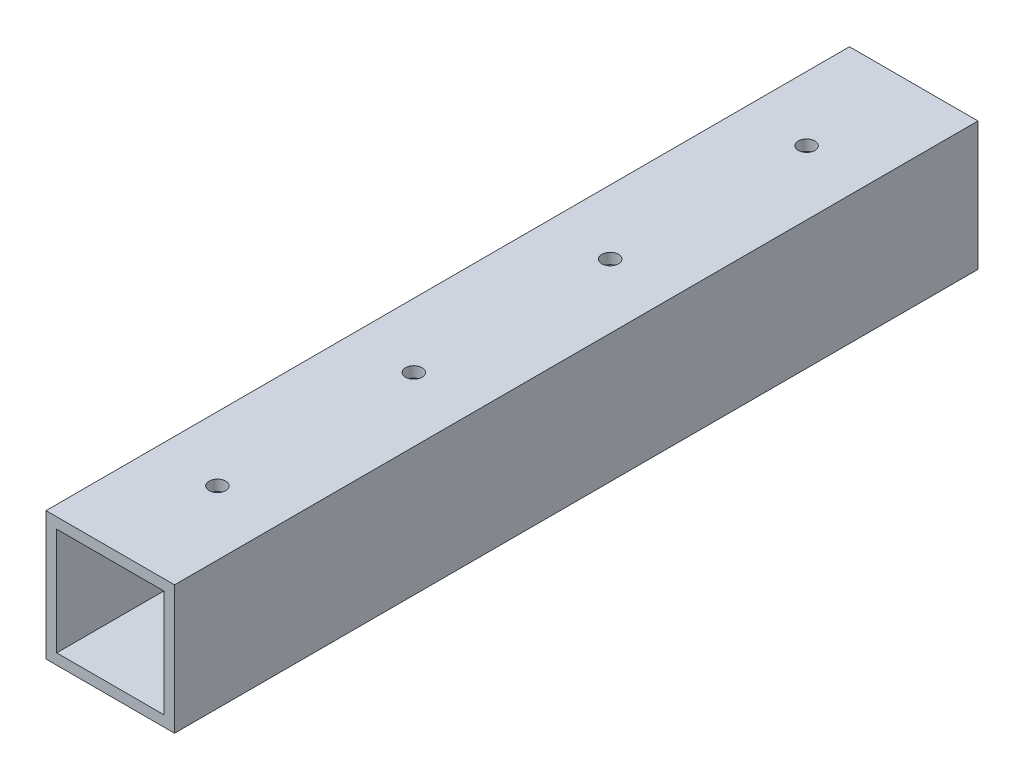
ISO-10303-21;
HEADER;
FILE_DESCRIPTION(('STEP AP214'),'2;1');
FILE_NAME('part.step','',(''),(''),'','','');
FILE_SCHEMA(('AUTOMOTIVE_DESIGN { 1 0 10303 214 1 1 1 1 }'));
ENDSEC;
DATA;
#1=APPLICATION_CONTEXT('core data for automotive mechanical design processes');
#2=APPLICATION_PROTOCOL_DEFINITION('international standard','automotive_design',2000,#1);
#3=PRODUCT_CONTEXT('',#1,'mechanical');
#4=PRODUCT('Part','Part','',(#3));
#5=PRODUCT_RELATED_PRODUCT_CATEGORY('part','',(#4));
#6=PRODUCT_DEFINITION_FORMATION('','',#4);
#7=PRODUCT_DEFINITION_CONTEXT('part definition',#1,'design');
#8=PRODUCT_DEFINITION('design','',#6,#7);
#9=PRODUCT_DEFINITION_SHAPE('','',#8);
#10=(LENGTH_UNIT() NAMED_UNIT(*) SI_UNIT(.MILLI.,.METRE.));
#11=(NAMED_UNIT(*) PLANE_ANGLE_UNIT() SI_UNIT($,.RADIAN.));
#12=(NAMED_UNIT(*) SI_UNIT($,.STERADIAN.) SOLID_ANGLE_UNIT());
#13=UNCERTAINTY_MEASURE_WITH_UNIT(LENGTH_MEASURE(1.E-05),#10,'distance_accuracy_value','');
#14=(GEOMETRIC_REPRESENTATION_CONTEXT(3) GLOBAL_UNCERTAINTY_ASSIGNED_CONTEXT((#13)) GLOBAL_UNIT_ASSIGNED_CONTEXT((#10,
#11,#12)) REPRESENTATION_CONTEXT('',''));
#15=CARTESIAN_POINT('',(0.,0.,0.));
#16=DIRECTION('',(0.,0.,1.));
#17=DIRECTION('',(1.,0.,0.));
#18=AXIS2_PLACEMENT_3D('',#15,#16,#17);
#19=CARTESIAN_POINT('',(0.,0.,238.125));
#20=DIRECTION('',(0.,0.,-1.));
#21=DIRECTION('',(-1.,0.,0.));
#22=AXIS2_PLACEMENT_3D('',#19,#20,#21);
#23=PLANE('',#22);
#24=DIRECTION('',(0.,1.,0.));
#25=VECTOR('',#24,1.);
#26=CARTESIAN_POINT('',(19.05,-19.05,238.125));
#27=LINE('',#26,#25);
#28=CARTESIAN_POINT('',(19.05,-19.05,238.125));
#29=VERTEX_POINT('',#28);
#30=CARTESIAN_POINT('',(19.05,19.05,238.125));
#31=VERTEX_POINT('',#30);
#32=EDGE_CURVE('E154',#29,#31,#27,.T.);
#33=ORIENTED_EDGE('',*,*,#32,.T.);
#34=DIRECTION('',(-1.,0.,0.));
#35=VECTOR('',#34,1.);
#36=CARTESIAN_POINT('',(-19.05,19.05,238.125));
#37=LINE('',#36,#35);
#38=CARTESIAN_POINT('',(-19.05,19.05,238.125));
#39=VERTEX_POINT('',#38);
#40=EDGE_CURVE('E158',#31,#39,#37,.T.);
#41=ORIENTED_EDGE('',*,*,#40,.T.);
#42=DIRECTION('',(0.,-1.,0.));
#43=VECTOR('',#42,1.);
#44=CARTESIAN_POINT('',(-19.05,-19.05,238.125));
#45=LINE('',#44,#43);
#46=CARTESIAN_POINT('',(-19.05,-19.05,238.125));
#47=VERTEX_POINT('',#46);
#48=EDGE_CURVE('E162',#39,#47,#45,.T.);
#49=ORIENTED_EDGE('',*,*,#48,.T.);
#50=DIRECTION('',(1.,0.,0.));
#51=VECTOR('',#50,1.);
#52=CARTESIAN_POINT('',(-19.05,-19.05,238.125));
#53=LINE('',#52,#51);
#54=EDGE_CURVE('E165',#47,#29,#53,.T.);
#55=ORIENTED_EDGE('',*,*,#54,.T.);
#56=EDGE_LOOP('',(#33,#41,#49,#55));
#57=FACE_BOUND('',#56,.T.);
#58=DIRECTION('',(0.,1.,0.));
#59=VECTOR('',#58,1.);
#60=CARTESIAN_POINT('',(15.875,-15.875,238.125));
#61=LINE('',#60,#59);
#62=CARTESIAN_POINT('',(15.875,-15.875,238.125));
#63=VERTEX_POINT('',#62);
#64=CARTESIAN_POINT('',(15.875,15.875,238.125));
#65=VERTEX_POINT('',#64);
#66=EDGE_CURVE('E103',#63,#65,#61,.T.);
#67=ORIENTED_EDGE('',*,*,#66,.F.);
#68=DIRECTION('',(1.,0.,0.));
#69=VECTOR('',#68,1.);
#70=CARTESIAN_POINT('',(-15.875,-15.875,238.125));
#71=LINE('',#70,#69);
#72=CARTESIAN_POINT('',(-15.875,-15.875,238.125));
#73=VERTEX_POINT('',#72);
#74=EDGE_CURVE('E130',#73,#63,#71,.T.);
#75=ORIENTED_EDGE('',*,*,#74,.F.);
#76=DIRECTION('',(0.,-1.,0.));
#77=VECTOR('',#76,1.);
#78=CARTESIAN_POINT('',(-15.875,-15.875,238.125));
#79=LINE('',#78,#77);
#80=CARTESIAN_POINT('',(-15.875,15.875,238.125));
#81=VERTEX_POINT('',#80);
#82=EDGE_CURVE('E125',#81,#73,#79,.T.);
#83=ORIENTED_EDGE('',*,*,#82,.F.);
#84=DIRECTION('',(-1.,0.,0.));
#85=VECTOR('',#84,1.);
#86=CARTESIAN_POINT('',(-15.875,15.875,238.125));
#87=LINE('',#86,#85);
#88=EDGE_CURVE('E112',#65,#81,#87,.T.);
#89=ORIENTED_EDGE('',*,*,#88,.F.);
#90=EDGE_LOOP('',(#67,#75,#83,#89));
#91=FACE_BOUND('',#90,.T.);
#92=ADVANCED_FACE('F35',(#57,#91),#23,.F.);
#93=CARTESIAN_POINT('',(0.,0.,0.));
#94=DIRECTION('',(0.,0.,-1.));
#95=DIRECTION('',(-1.,0.,0.));
#96=AXIS2_PLACEMENT_3D('',#93,#94,#95);
#97=PLANE('',#96);
#98=DIRECTION('',(0.,1.,0.));
#99=VECTOR('',#98,1.);
#100=CARTESIAN_POINT('',(19.05,-19.05,0.));
#101=LINE('',#100,#99);
#102=CARTESIAN_POINT('',(19.05,-19.05,0.));
#103=VERTEX_POINT('',#102);
#104=CARTESIAN_POINT('',(19.05,19.05,0.));
#105=VERTEX_POINT('',#104);
#106=EDGE_CURVE('E121',#103,#105,#101,.T.);
#107=ORIENTED_EDGE('',*,*,#106,.F.);
#108=DIRECTION('',(1.,0.,0.));
#109=VECTOR('',#108,1.);
#110=CARTESIAN_POINT('',(-19.05,-19.05,0.));
#111=LINE('',#110,#109);
#112=CARTESIAN_POINT('',(-19.05,-19.05,0.));
#113=VERTEX_POINT('',#112);
#114=EDGE_CURVE('E159',#113,#103,#111,.T.);
#115=ORIENTED_EDGE('',*,*,#114,.F.);
#116=DIRECTION('',(0.,-1.,0.));
#117=VECTOR('',#116,1.);
#118=CARTESIAN_POINT('',(-19.05,-19.05,0.));
#119=LINE('',#118,#117);
#120=CARTESIAN_POINT('',(-19.05,19.05,0.));
#121=VERTEX_POINT('',#120);
#122=EDGE_CURVE('E175',#121,#113,#119,.T.);
#123=ORIENTED_EDGE('',*,*,#122,.F.);
#124=DIRECTION('',(-1.,0.,0.));
#125=VECTOR('',#124,1.);
#126=CARTESIAN_POINT('',(-19.05,19.05,0.));
#127=LINE('',#126,#125);
#128=EDGE_CURVE('E172',#105,#121,#127,.T.);
#129=ORIENTED_EDGE('',*,*,#128,.F.);
#130=EDGE_LOOP('',(#107,#115,#123,#129));
#131=FACE_BOUND('',#130,.T.);
#132=DIRECTION('',(1.,0.,0.));
#133=VECTOR('',#132,1.);
#134=CARTESIAN_POINT('',(-15.875,-15.875,0.));
#135=LINE('',#134,#133);
#136=CARTESIAN_POINT('',(-15.875,-15.875,0.));
#137=VERTEX_POINT('',#136);
#138=CARTESIAN_POINT('',(15.875,-15.875,0.));
#139=VERTEX_POINT('',#138);
#140=EDGE_CURVE('E113',#137,#139,#135,.T.);
#141=ORIENTED_EDGE('',*,*,#140,.T.);
#142=DIRECTION('',(0.,1.,0.));
#143=VECTOR('',#142,1.);
#144=CARTESIAN_POINT('',(15.875,-15.875,0.));
#145=LINE('',#144,#143);
#146=CARTESIAN_POINT('',(15.875,15.875,0.));
#147=VERTEX_POINT('',#146);
#148=EDGE_CURVE('E61',#139,#147,#145,.T.);
#149=ORIENTED_EDGE('',*,*,#148,.T.);
#150=DIRECTION('',(-1.,0.,0.));
#151=VECTOR('',#150,1.);
#152=CARTESIAN_POINT('',(-15.875,15.875,0.));
#153=LINE('',#152,#151);
#154=CARTESIAN_POINT('',(-15.875,15.875,0.));
#155=VERTEX_POINT('',#154);
#156=EDGE_CURVE('E119',#147,#155,#153,.T.);
#157=ORIENTED_EDGE('',*,*,#156,.T.);
#158=DIRECTION('',(0.,-1.,0.));
#159=VECTOR('',#158,1.);
#160=CARTESIAN_POINT('',(-15.875,-15.875,0.));
#161=LINE('',#160,#159);
#162=EDGE_CURVE('E141',#155,#137,#161,.T.);
#163=ORIENTED_EDGE('',*,*,#162,.T.);
#164=EDGE_LOOP('',(#141,#149,#157,#163));
#165=FACE_BOUND('',#164,.T.);
#166=ADVANCED_FACE('F256',(#131,#165),#97,.T.);
#167=CARTESIAN_POINT('',(19.05,-19.05,238.125));
#168=DIRECTION('',(-1.,0.,0.));
#169=DIRECTION('',(0.,0.,1.));
#170=AXIS2_PLACEMENT_3D('',#167,#168,#169);
#171=PLANE('',#170);
#172=ORIENTED_EDGE('',*,*,#106,.T.);
#173=DIRECTION('',(0.,0.,-1.));
#174=VECTOR('',#173,1.);
#175=CARTESIAN_POINT('',(19.05,19.05,238.125));
#176=LINE('',#175,#174);
#177=EDGE_CURVE('E11',#31,#105,#176,.T.);
#178=ORIENTED_EDGE('',*,*,#177,.F.);
#179=ORIENTED_EDGE('',*,*,#32,.F.);
#180=DIRECTION('',(0.,0.,-1.));
#181=VECTOR('',#180,1.);
#182=CARTESIAN_POINT('',(19.05,-19.05,238.125));
#183=LINE('',#182,#181);
#184=EDGE_CURVE('E168',#29,#103,#183,.T.);
#185=ORIENTED_EDGE('',*,*,#184,.T.);
#186=EDGE_LOOP('',(#172,#178,#179,#185));
#187=FACE_BOUND('',#186,.T.);
#188=ADVANCED_FACE('F37',(#187),#171,.F.);
#189=CARTESIAN_POINT('',(-19.05,19.05,238.125));
#190=DIRECTION('',(0.,-1.,0.));
#191=DIRECTION('',(0.,0.,-1.));
#192=AXIS2_PLACEMENT_3D('',#189,#190,#191);
#193=PLANE('',#192);
#194=CARTESIAN_POINT('',(0.,19.05,31.75));
#195=DIRECTION('',(0.,1.,0.));
#196=DIRECTION('',(0.,0.,1.));
#197=AXIS2_PLACEMENT_3D('',#194,#195,#196);
#198=CIRCLE('',#197,2.45744999999999);
#199=CARTESIAN_POINT('',(0.,19.05,34.20745));
#200=VERTEX_POINT('',#199);
#201=EDGE_CURVE('E292',#200,#200,#198,.T.);
#202=ORIENTED_EDGE('',*,*,#201,.F.);
#203=EDGE_LOOP('',(#202));
#204=FACE_BOUND('',#203,.T.);
#205=CARTESIAN_POINT('',(-1.90819582357449E-13,19.05,89.9583333333335));
#206=DIRECTION('',(0.,1.,0.));
#207=DIRECTION('',(0.,0.,1.));
#208=AXIS2_PLACEMENT_3D('',#205,#206,#207);
#209=CIRCLE('',#208,2.45744999999999);
#210=CARTESIAN_POINT('',(-1.90819582357449E-13,19.05,92.4157833333335));
#211=VERTEX_POINT('',#210);
#212=EDGE_CURVE('E214',#211,#211,#209,.T.);
#213=ORIENTED_EDGE('',*,*,#212,.F.);
#214=EDGE_LOOP('',(#213));
#215=FACE_BOUND('',#214,.T.);
#216=CARTESIAN_POINT('',(8.36136715420821E-13,19.05,148.166666666667));
#217=DIRECTION('',(0.,1.,0.));
#218=DIRECTION('',(0.,0.,1.));
#219=AXIS2_PLACEMENT_3D('',#216,#217,#218);
#220=CIRCLE('',#219,2.45744999999999);
#221=CARTESIAN_POINT('',(8.36136715420821E-13,19.05,150.624116666667));
#222=VERTEX_POINT('',#221);
#223=EDGE_CURVE('E211',#222,#222,#220,.T.);
#224=ORIENTED_EDGE('',*,*,#223,.F.);
#225=EDGE_LOOP('',(#224));
#226=FACE_BOUND('',#225,.T.);
#227=CARTESIAN_POINT('',(1.38777878078145E-12,19.05,206.375));
#228=DIRECTION('',(0.,1.,0.));
#229=DIRECTION('',(0.,0.,1.));
#230=AXIS2_PLACEMENT_3D('',#227,#228,#229);
#231=CIRCLE('',#230,2.45744999999999);
#232=CARTESIAN_POINT('',(1.38777878078145E-12,19.05,208.83245));
#233=VERTEX_POINT('',#232);
#234=EDGE_CURVE('E234',#233,#233,#231,.T.);
#235=ORIENTED_EDGE('',*,*,#234,.F.);
#236=EDGE_LOOP('',(#235));
#237=FACE_BOUND('',#236,.T.);
#238=ORIENTED_EDGE('',*,*,#128,.T.);
#239=DIRECTION('',(0.,0.,-1.));
#240=VECTOR('',#239,1.);
#241=CARTESIAN_POINT('',(-19.05,19.05,238.125));
#242=LINE('',#241,#240);
#243=EDGE_CURVE('E45',#39,#121,#242,.T.);
#244=ORIENTED_EDGE('',*,*,#243,.F.);
#245=ORIENTED_EDGE('',*,*,#40,.F.);
#246=ORIENTED_EDGE('',*,*,#177,.T.);
#247=EDGE_LOOP('',(#238,#244,#245,#246));
#248=FACE_BOUND('',#247,.T.);
#249=ADVANCED_FACE('F281',(#204,#215,#226,#237,#248),#193,.F.);
#250=CARTESIAN_POINT('',(-19.05,-19.05,238.125));
#251=DIRECTION('',(1.,0.,0.));
#252=DIRECTION('',(0.,0.,-1.));
#253=AXIS2_PLACEMENT_3D('',#250,#251,#252);
#254=PLANE('',#253);
#255=ORIENTED_EDGE('',*,*,#122,.T.);
#256=DIRECTION('',(0.,0.,-1.));
#257=VECTOR('',#256,1.);
#258=CARTESIAN_POINT('',(-19.05,-19.05,238.125));
#259=LINE('',#258,#257);
#260=EDGE_CURVE('E183',#47,#113,#259,.T.);
#261=ORIENTED_EDGE('',*,*,#260,.F.);
#262=ORIENTED_EDGE('',*,*,#48,.F.);
#263=ORIENTED_EDGE('',*,*,#243,.T.);
#264=EDGE_LOOP('',(#255,#261,#262,#263));
#265=FACE_BOUND('',#264,.T.);
#266=ADVANCED_FACE('F278',(#265),#254,.F.);
#267=CARTESIAN_POINT('',(-19.05,-19.05,238.125));
#268=DIRECTION('',(0.,1.,0.));
#269=DIRECTION('',(0.,0.,1.));
#270=AXIS2_PLACEMENT_3D('',#267,#268,#269);
#271=PLANE('',#270);
#272=CARTESIAN_POINT('',(0.,-19.05,31.75));
#273=DIRECTION('',(0.,1.,0.));
#274=DIRECTION('',(0.,0.,1.));
#275=AXIS2_PLACEMENT_3D('',#272,#273,#274);
#276=CIRCLE('',#275,2.45745);
#277=CARTESIAN_POINT('',(0.,-19.05,34.20745));
#278=VERTEX_POINT('',#277);
#279=EDGE_CURVE('E341',#278,#278,#276,.T.);
#280=ORIENTED_EDGE('',*,*,#279,.T.);
#281=EDGE_LOOP('',(#280));
#282=FACE_BOUND('',#281,.T.);
#283=CARTESIAN_POINT('',(-1.90819582357449E-13,-19.05,89.9583333333335));
#284=DIRECTION('',(0.,1.,0.));
#285=DIRECTION('',(0.,0.,1.));
#286=AXIS2_PLACEMENT_3D('',#283,#284,#285);
#287=CIRCLE('',#286,2.45745);
#288=CARTESIAN_POINT('',(-1.90819582357449E-13,-19.05,92.4157833333335));
#289=VERTEX_POINT('',#288);
#290=EDGE_CURVE('E204',#289,#289,#287,.T.);
#291=ORIENTED_EDGE('',*,*,#290,.T.);
#292=EDGE_LOOP('',(#291));
#293=FACE_BOUND('',#292,.T.);
#294=CARTESIAN_POINT('',(8.36136715420821E-13,-19.05,148.166666666667));
#295=DIRECTION('',(0.,1.,0.));
#296=DIRECTION('',(0.,0.,1.));
#297=AXIS2_PLACEMENT_3D('',#294,#295,#296);
#298=CIRCLE('',#297,2.45745);
#299=CARTESIAN_POINT('',(8.36136715420821E-13,-19.05,150.624116666667));
#300=VERTEX_POINT('',#299);
#301=EDGE_CURVE('E199',#300,#300,#298,.T.);
#302=ORIENTED_EDGE('',*,*,#301,.T.);
#303=EDGE_LOOP('',(#302));
#304=FACE_BOUND('',#303,.T.);
#305=CARTESIAN_POINT('',(1.38777878078145E-12,-19.05,206.375));
#306=DIRECTION('',(0.,1.,0.));
#307=DIRECTION('',(0.,0.,1.));
#308=AXIS2_PLACEMENT_3D('',#305,#306,#307);
#309=CIRCLE('',#308,2.45745);
#310=CARTESIAN_POINT('',(1.38777878078145E-12,-19.05,208.83245));
#311=VERTEX_POINT('',#310);
#312=EDGE_CURVE('E194',#311,#311,#309,.T.);
#313=ORIENTED_EDGE('',*,*,#312,.T.);
#314=EDGE_LOOP('',(#313));
#315=FACE_BOUND('',#314,.T.);
#316=ORIENTED_EDGE('',*,*,#114,.T.);
#317=ORIENTED_EDGE('',*,*,#184,.F.);
#318=ORIENTED_EDGE('',*,*,#54,.F.);
#319=ORIENTED_EDGE('',*,*,#260,.T.);
#320=EDGE_LOOP('',(#316,#317,#318,#319));
#321=FACE_BOUND('',#320,.T.);
#322=ADVANCED_FACE('F275',(#282,#293,#304,#315,#321),#271,.F.);
#323=CARTESIAN_POINT('',(15.875,-15.875,238.125));
#324=DIRECTION('',(-1.,0.,0.));
#325=DIRECTION('',(0.,0.,1.));
#326=AXIS2_PLACEMENT_3D('',#323,#324,#325);
#327=PLANE('',#326);
#328=ORIENTED_EDGE('',*,*,#148,.F.);
#329=DIRECTION('',(0.,0.,-1.));
#330=VECTOR('',#329,1.);
#331=CARTESIAN_POINT('',(15.875,-15.875,238.125));
#332=LINE('',#331,#330);
#333=EDGE_CURVE('E107',#63,#139,#332,.T.);
#334=ORIENTED_EDGE('',*,*,#333,.F.);
#335=ORIENTED_EDGE('',*,*,#66,.T.);
#336=DIRECTION('',(0.,0.,-1.));
#337=VECTOR('',#336,1.);
#338=CARTESIAN_POINT('',(15.875,15.875,238.125));
#339=LINE('',#338,#337);
#340=EDGE_CURVE('E106',#65,#147,#339,.T.);
#341=ORIENTED_EDGE('',*,*,#340,.T.);
#342=EDGE_LOOP('',(#328,#334,#335,#341));
#343=FACE_BOUND('',#342,.T.);
#344=ADVANCED_FACE('F105',(#343),#327,.T.);
#345=CARTESIAN_POINT('',(-15.875,15.875,238.125));
#346=DIRECTION('',(0.,-1.,0.));
#347=DIRECTION('',(0.,0.,-1.));
#348=AXIS2_PLACEMENT_3D('',#345,#346,#347);
#349=PLANE('',#348);
#350=CARTESIAN_POINT('',(0.,15.875,31.75));
#351=DIRECTION('',(0.,-1.,0.));
#352=DIRECTION('',(0.,0.,-1.));
#353=AXIS2_PLACEMENT_3D('',#350,#351,#352);
#354=CIRCLE('',#353,2.45744999999999);
#355=CARTESIAN_POINT('',(0.,15.875,29.29255));
#356=VERTEX_POINT('',#355);
#357=EDGE_CURVE('E39',#356,#356,#354,.T.);
#358=ORIENTED_EDGE('',*,*,#357,.F.);
#359=EDGE_LOOP('',(#358));
#360=FACE_BOUND('',#359,.T.);
#361=CARTESIAN_POINT('',(-1.90819582357449E-13,15.875,89.9583333333335));
#362=DIRECTION('',(0.,-1.,0.));
#363=DIRECTION('',(0.,0.,-1.));
#364=AXIS2_PLACEMENT_3D('',#361,#362,#363);
#365=CIRCLE('',#364,2.45744999999999);
#366=CARTESIAN_POINT('',(-1.90819582357449E-13,15.875,87.5008833333335));
#367=VERTEX_POINT('',#366);
#368=EDGE_CURVE('E203',#367,#367,#365,.T.);
#369=ORIENTED_EDGE('',*,*,#368,.F.);
#370=EDGE_LOOP('',(#369));
#371=FACE_BOUND('',#370,.T.);
#372=CARTESIAN_POINT('',(8.36136715420821E-13,15.875,148.166666666667));
#373=DIRECTION('',(0.,-1.,0.));
#374=DIRECTION('',(0.,0.,-1.));
#375=AXIS2_PLACEMENT_3D('',#372,#373,#374);
#376=CIRCLE('',#375,2.45744999999999);
#377=CARTESIAN_POINT('',(8.36136715420821E-13,15.875,145.709216666667));
#378=VERTEX_POINT('',#377);
#379=EDGE_CURVE('E198',#378,#378,#376,.T.);
#380=ORIENTED_EDGE('',*,*,#379,.F.);
#381=EDGE_LOOP('',(#380));
#382=FACE_BOUND('',#381,.T.);
#383=CARTESIAN_POINT('',(1.38777878078145E-12,15.875,206.375));
#384=DIRECTION('',(0.,-1.,0.));
#385=DIRECTION('',(0.,0.,-1.));
#386=AXIS2_PLACEMENT_3D('',#383,#384,#385);
#387=CIRCLE('',#386,2.45744999999999);
#388=CARTESIAN_POINT('',(1.38777878078145E-12,15.875,203.91755));
#389=VERTEX_POINT('',#388);
#390=EDGE_CURVE('E190',#389,#389,#387,.T.);
#391=ORIENTED_EDGE('',*,*,#390,.F.);
#392=EDGE_LOOP('',(#391));
#393=FACE_BOUND('',#392,.T.);
#394=ORIENTED_EDGE('',*,*,#156,.F.);
#395=ORIENTED_EDGE('',*,*,#340,.F.);
#396=ORIENTED_EDGE('',*,*,#88,.T.);
#397=DIRECTION('',(0.,0.,-1.));
#398=VECTOR('',#397,1.);
#399=CARTESIAN_POINT('',(-15.875,15.875,238.125));
#400=LINE('',#399,#398);
#401=EDGE_CURVE('E122',#81,#155,#400,.T.);
#402=ORIENTED_EDGE('',*,*,#401,.T.);
#403=EDGE_LOOP('',(#394,#395,#396,#402));
#404=FACE_BOUND('',#403,.T.);
#405=ADVANCED_FACE('F116',(#360,#371,#382,#393,#404),#349,.T.);
#406=CARTESIAN_POINT('',(-15.875,-15.875,238.125));
#407=DIRECTION('',(1.,0.,0.));
#408=DIRECTION('',(0.,0.,-1.));
#409=AXIS2_PLACEMENT_3D('',#406,#407,#408);
#410=PLANE('',#409);
#411=ORIENTED_EDGE('',*,*,#162,.F.);
#412=ORIENTED_EDGE('',*,*,#401,.F.);
#413=ORIENTED_EDGE('',*,*,#82,.T.);
#414=DIRECTION('',(0.,0.,-1.));
#415=VECTOR('',#414,1.);
#416=CARTESIAN_POINT('',(-15.875,-15.875,238.125));
#417=LINE('',#416,#415);
#418=EDGE_CURVE('E53',#73,#137,#417,.T.);
#419=ORIENTED_EDGE('',*,*,#418,.T.);
#420=EDGE_LOOP('',(#411,#412,#413,#419));
#421=FACE_BOUND('',#420,.T.);
#422=ADVANCED_FACE('F251',(#421),#410,.T.);
#423=CARTESIAN_POINT('',(-15.875,-15.875,238.125));
#424=DIRECTION('',(0.,1.,0.));
#425=DIRECTION('',(0.,0.,1.));
#426=AXIS2_PLACEMENT_3D('',#423,#424,#425);
#427=PLANE('',#426);
#428=CARTESIAN_POINT('',(0.,-15.875,31.75));
#429=DIRECTION('',(0.,1.,0.));
#430=DIRECTION('',(0.,0.,1.));
#431=AXIS2_PLACEMENT_3D('',#428,#429,#430);
#432=CIRCLE('',#431,2.45744999999999);
#433=CARTESIAN_POINT('',(0.,-15.875,34.20745));
#434=VERTEX_POINT('',#433);
#435=EDGE_CURVE('E221',#434,#434,#432,.T.);
#436=ORIENTED_EDGE('',*,*,#435,.F.);
#437=EDGE_LOOP('',(#436));
#438=FACE_BOUND('',#437,.T.);
#439=CARTESIAN_POINT('',(-1.90819582357449E-13,-15.875,89.9583333333335));
#440=DIRECTION('',(0.,1.,0.));
#441=DIRECTION('',(0.,0.,1.));
#442=AXIS2_PLACEMENT_3D('',#439,#440,#441);
#443=CIRCLE('',#442,2.45744999999999);
#444=CARTESIAN_POINT('',(-1.90819582357449E-13,-15.875,92.4157833333335));
#445=VERTEX_POINT('',#444);
#446=EDGE_CURVE('E200',#445,#445,#443,.T.);
#447=ORIENTED_EDGE('',*,*,#446,.F.);
#448=EDGE_LOOP('',(#447));
#449=FACE_BOUND('',#448,.T.);
#450=CARTESIAN_POINT('',(8.36136715420821E-13,-15.875,148.166666666667));
#451=DIRECTION('',(0.,1.,0.));
#452=DIRECTION('',(0.,0.,1.));
#453=AXIS2_PLACEMENT_3D('',#450,#451,#452);
#454=CIRCLE('',#453,2.45744999999999);
#455=CARTESIAN_POINT('',(8.36136715420821E-13,-15.875,150.624116666667));
#456=VERTEX_POINT('',#455);
#457=EDGE_CURVE('E195',#456,#456,#454,.T.);
#458=ORIENTED_EDGE('',*,*,#457,.F.);
#459=EDGE_LOOP('',(#458));
#460=FACE_BOUND('',#459,.T.);
#461=CARTESIAN_POINT('',(1.38777878078145E-12,-15.875,206.375));
#462=DIRECTION('',(0.,1.,0.));
#463=DIRECTION('',(0.,0.,1.));
#464=AXIS2_PLACEMENT_3D('',#461,#462,#463);
#465=CIRCLE('',#464,2.45744999999999);
#466=CARTESIAN_POINT('',(1.38777878078145E-12,-15.875,208.83245));
#467=VERTEX_POINT('',#466);
#468=EDGE_CURVE('E138',#467,#467,#465,.T.);
#469=ORIENTED_EDGE('',*,*,#468,.F.);
#470=EDGE_LOOP('',(#469));
#471=FACE_BOUND('',#470,.T.);
#472=ORIENTED_EDGE('',*,*,#140,.F.);
#473=ORIENTED_EDGE('',*,*,#418,.F.);
#474=ORIENTED_EDGE('',*,*,#74,.T.);
#475=ORIENTED_EDGE('',*,*,#333,.T.);
#476=EDGE_LOOP('',(#472,#473,#474,#475));
#477=FACE_BOUND('',#476,.T.);
#478=ADVANCED_FACE('F248',(#438,#449,#460,#471,#477),#427,.T.);
#479=CARTESIAN_POINT('',(1.38777878078145E-12,19.05,206.375));
#480=DIRECTION('',(0.,1.,0.));
#481=DIRECTION('',(0.,0.,1.));
#482=AXIS2_PLACEMENT_3D('',#479,#480,#481);
#483=CYLINDRICAL_SURFACE('',#482,2.45744999999999);
#484=ORIENTED_EDGE('',*,*,#390,.T.);
#485=EDGE_LOOP('',(#484));
#486=FACE_BOUND('',#485,.T.);
#487=ORIENTED_EDGE('',*,*,#234,.T.);
#488=EDGE_LOOP('',(#487));
#489=FACE_BOUND('',#488,.T.);
#490=ADVANCED_FACE('F250',(#486,#489),#483,.F.);
#491=ORIENTED_EDGE('',*,*,#468,.T.);
#492=EDGE_LOOP('',(#491));
#493=FACE_BOUND('',#492,.T.);
#494=ORIENTED_EDGE('',*,*,#312,.F.);
#495=EDGE_LOOP('',(#494));
#496=FACE_BOUND('',#495,.T.);
#497=ADVANCED_FACE('F245',(#493,#496),#483,.F.);
#498=CARTESIAN_POINT('',(8.36136715420821E-13,19.05,148.166666666667));
#499=DIRECTION('',(0.,1.,0.));
#500=DIRECTION('',(0.,0.,1.));
#501=AXIS2_PLACEMENT_3D('',#498,#499,#500);
#502=CYLINDRICAL_SURFACE('',#501,2.45744999999999);
#503=ORIENTED_EDGE('',*,*,#457,.T.);
#504=EDGE_LOOP('',(#503));
#505=FACE_BOUND('',#504,.T.);
#506=ORIENTED_EDGE('',*,*,#301,.F.);
#507=EDGE_LOOP('',(#506));
#508=FACE_BOUND('',#507,.T.);
#509=ADVANCED_FACE('F317',(#505,#508),#502,.F.);
#510=ORIENTED_EDGE('',*,*,#379,.T.);
#511=EDGE_LOOP('',(#510));
#512=FACE_BOUND('',#511,.T.);
#513=ORIENTED_EDGE('',*,*,#223,.T.);
#514=EDGE_LOOP('',(#513));
#515=FACE_BOUND('',#514,.T.);
#516=ADVANCED_FACE('F321',(#512,#515),#502,.F.);
#517=CARTESIAN_POINT('',(-1.90819582357449E-13,19.05,89.9583333333335));
#518=DIRECTION('',(0.,1.,0.));
#519=DIRECTION('',(0.,0.,1.));
#520=AXIS2_PLACEMENT_3D('',#517,#518,#519);
#521=CYLINDRICAL_SURFACE('',#520,2.45744999999999);
#522=ORIENTED_EDGE('',*,*,#446,.T.);
#523=EDGE_LOOP('',(#522));
#524=FACE_BOUND('',#523,.T.);
#525=ORIENTED_EDGE('',*,*,#290,.F.);
#526=EDGE_LOOP('',(#525));
#527=FACE_BOUND('',#526,.T.);
#528=ADVANCED_FACE('F323',(#524,#527),#521,.F.);
#529=ORIENTED_EDGE('',*,*,#368,.T.);
#530=EDGE_LOOP('',(#529));
#531=FACE_BOUND('',#530,.T.);
#532=ORIENTED_EDGE('',*,*,#212,.T.);
#533=EDGE_LOOP('',(#532));
#534=FACE_BOUND('',#533,.T.);
#535=ADVANCED_FACE('F326',(#531,#534),#521,.F.);
#536=CARTESIAN_POINT('',(0.,19.05,31.75));
#537=DIRECTION('',(0.,1.,0.));
#538=DIRECTION('',(0.,0.,1.));
#539=AXIS2_PLACEMENT_3D('',#536,#537,#538);
#540=CYLINDRICAL_SURFACE('',#539,2.45744999999999);
#541=ORIENTED_EDGE('',*,*,#357,.T.);
#542=EDGE_LOOP('',(#541));
#543=FACE_BOUND('',#542,.T.);
#544=ORIENTED_EDGE('',*,*,#201,.T.);
#545=EDGE_LOOP('',(#544));
#546=FACE_BOUND('',#545,.T.);
#547=ADVANCED_FACE('F327',(#543,#546),#540,.F.);
#548=ORIENTED_EDGE('',*,*,#435,.T.);
#549=EDGE_LOOP('',(#548));
#550=FACE_BOUND('',#549,.T.);
#551=ORIENTED_EDGE('',*,*,#279,.F.);
#552=EDGE_LOOP('',(#551));
#553=FACE_BOUND('',#552,.T.);
#554=ADVANCED_FACE('F329',(#550,#553),#540,.F.);
#555=CLOSED_SHELL('',(#92,#166,#188,#249,#266,#322,#344,#405,#422,#478,#490,#497,#509,#516,#528,
#535,#547,#554));
#556=MANIFOLD_SOLID_BREP('B2',#555);
#557=ADVANCED_BREP_SHAPE_REPRESENTATION('',(#18,#556),#14);
#558=SHAPE_DEFINITION_REPRESENTATION(#9,#557);
ENDSEC;
END-ISO-10303-21;
